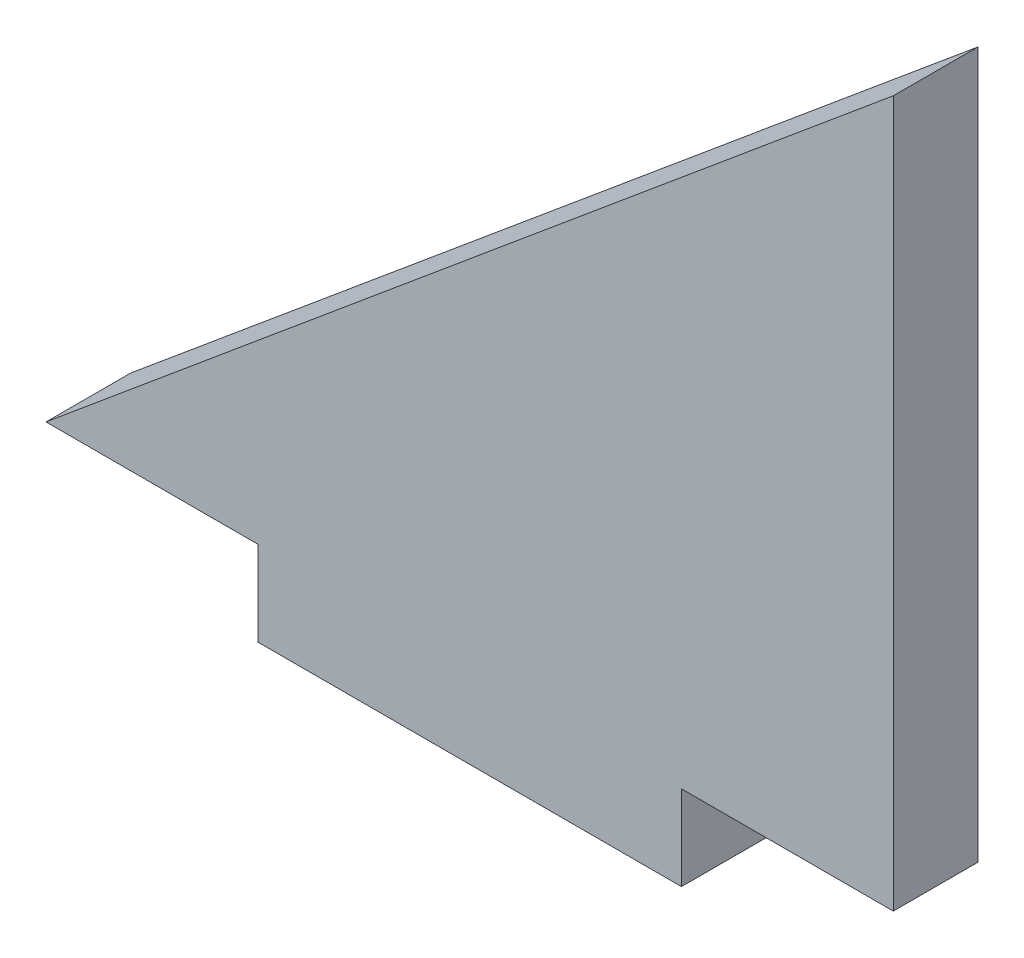
ISO-10303-21;
HEADER;
FILE_DESCRIPTION(('STEP AP214'),'2;1');
FILE_NAME('part.step','',(''),(''),'','','');
FILE_SCHEMA(('AUTOMOTIVE_DESIGN { 1 0 10303 214 1 1 1 1 }'));
ENDSEC;
DATA;
#1=APPLICATION_CONTEXT('core data for automotive mechanical design processes');
#2=APPLICATION_PROTOCOL_DEFINITION('international standard','automotive_design',2000,#1);
#3=PRODUCT_CONTEXT('',#1,'mechanical');
#4=PRODUCT('Part','Part','',(#3));
#5=PRODUCT_RELATED_PRODUCT_CATEGORY('part','',(#4));
#6=PRODUCT_DEFINITION_FORMATION('','',#4);
#7=PRODUCT_DEFINITION_CONTEXT('part definition',#1,'design');
#8=PRODUCT_DEFINITION('design','',#6,#7);
#9=PRODUCT_DEFINITION_SHAPE('','',#8);
#10=(LENGTH_UNIT() NAMED_UNIT(*) SI_UNIT(.MILLI.,.METRE.));
#11=(NAMED_UNIT(*) PLANE_ANGLE_UNIT() SI_UNIT($,.RADIAN.));
#12=(NAMED_UNIT(*) SI_UNIT($,.STERADIAN.) SOLID_ANGLE_UNIT());
#13=UNCERTAINTY_MEASURE_WITH_UNIT(LENGTH_MEASURE(1.E-05),#10,'distance_accuracy_value','');
#14=(GEOMETRIC_REPRESENTATION_CONTEXT(3) GLOBAL_UNCERTAINTY_ASSIGNED_CONTEXT((#13)) GLOBAL_UNIT_ASSIGNED_CONTEXT((#10,
#11,#12)) REPRESENTATION_CONTEXT('',''));
#15=CARTESIAN_POINT('',(0.,0.,0.));
#16=DIRECTION('',(0.,0.,1.));
#17=DIRECTION('',(1.,0.,0.));
#18=AXIS2_PLACEMENT_3D('',#15,#16,#17);
#19=CARTESIAN_POINT('',(0.,25.,1.5));
#20=DIRECTION('',(-1.,0.,0.));
#21=DIRECTION('',(0.,0.,1.));
#22=AXIS2_PLACEMENT_3D('',#19,#20,#21);
#23=PLANE('',#22);
#24=DIRECTION('',(0.,1.,0.));
#25=VECTOR('',#24,1.);
#26=CARTESIAN_POINT('',(0.,25.,-1.5));
#27=LINE('',#26,#25);
#28=CARTESIAN_POINT('',(0.,0.,-1.5));
#29=VERTEX_POINT('',#28);
#30=CARTESIAN_POINT('',(0.,25.,-1.5));
#31=VERTEX_POINT('',#30);
#32=EDGE_CURVE('E129',#29,#31,#27,.T.);
#33=ORIENTED_EDGE('',*,*,#32,.T.);
#34=DIRECTION('',(0.,0.,-1.));
#35=VECTOR('',#34,1.);
#36=CARTESIAN_POINT('',(0.,25.,1.5));
#37=LINE('',#36,#35);
#38=CARTESIAN_POINT('',(0.,25.,1.5));
#39=VERTEX_POINT('',#38);
#40=EDGE_CURVE('E11',#39,#31,#37,.T.);
#41=ORIENTED_EDGE('',*,*,#40,.F.);
#42=DIRECTION('',(0.,1.,0.));
#43=VECTOR('',#42,1.);
#44=CARTESIAN_POINT('',(0.,25.,1.5));
#45=LINE('',#44,#43);
#46=CARTESIAN_POINT('',(0.,0.,1.5));
#47=VERTEX_POINT('',#46);
#48=EDGE_CURVE('E141',#47,#39,#45,.T.);
#49=ORIENTED_EDGE('',*,*,#48,.F.);
#50=DIRECTION('',(0.,0.,-1.));
#51=VECTOR('',#50,1.);
#52=CARTESIAN_POINT('',(0.,0.,1.5));
#53=LINE('',#52,#51);
#54=EDGE_CURVE('E125',#47,#29,#53,.T.);
#55=ORIENTED_EDGE('',*,*,#54,.T.);
#56=EDGE_LOOP('',(#33,#41,#49,#55));
#57=FACE_BOUND('',#56,.T.);
#58=ADVANCED_FACE('F39',(#57),#23,.F.);
#59=CARTESIAN_POINT('',(-30.,0.,1.5));
#60=DIRECTION('',(0.64018439966448,-0.768221279597376,0.));
#61=DIRECTION('',(0.768221279597376,0.64018439966448,0.));
#62=AXIS2_PLACEMENT_3D('',#59,#60,#61);
#63=PLANE('',#62);
#64=DIRECTION('',(-0.768221279597376,-0.64018439966448,0.));
#65=VECTOR('',#64,1.);
#66=CARTESIAN_POINT('',(-30.,0.,-1.5));
#67=LINE('',#66,#65);
#68=CARTESIAN_POINT('',(-30.,0.,-1.5));
#69=VERTEX_POINT('',#68);
#70=EDGE_CURVE('E132',#31,#69,#67,.T.);
#71=ORIENTED_EDGE('',*,*,#70,.T.);
#72=DIRECTION('',(0.,0.,-1.));
#73=VECTOR('',#72,1.);
#74=CARTESIAN_POINT('',(-30.,0.,1.5));
#75=LINE('',#74,#73);
#76=CARTESIAN_POINT('',(-30.,0.,1.5));
#77=VERTEX_POINT('',#76);
#78=EDGE_CURVE('E47',#77,#69,#75,.T.);
#79=ORIENTED_EDGE('',*,*,#78,.F.);
#80=DIRECTION('',(-0.768221279597376,-0.64018439966448,0.));
#81=VECTOR('',#80,1.);
#82=CARTESIAN_POINT('',(-30.,0.,1.5));
#83=LINE('',#82,#81);
#84=EDGE_CURVE('E95',#39,#77,#83,.T.);
#85=ORIENTED_EDGE('',*,*,#84,.F.);
#86=ORIENTED_EDGE('',*,*,#40,.T.);
#87=EDGE_LOOP('',(#71,#79,#85,#86));
#88=FACE_BOUND('',#87,.T.);
#89=ADVANCED_FACE('F166',(#88),#63,.F.);
#90=CARTESIAN_POINT('',(-22.5,0.,1.5));
#91=DIRECTION('',(0.,1.,0.));
#92=DIRECTION('',(-1.,0.,0.));
#93=AXIS2_PLACEMENT_3D('',#90,#91,#92);
#94=PLANE('',#93);
#95=DIRECTION('',(1.,0.,0.));
#96=VECTOR('',#95,1.);
#97=CARTESIAN_POINT('',(-22.5,0.,-1.5));
#98=LINE('',#97,#96);
#99=CARTESIAN_POINT('',(-22.5,0.,-1.5));
#100=VERTEX_POINT('',#99);
#101=EDGE_CURVE('E134',#69,#100,#98,.T.);
#102=ORIENTED_EDGE('',*,*,#101,.T.);
#103=DIRECTION('',(0.,0.,-1.));
#104=VECTOR('',#103,1.);
#105=CARTESIAN_POINT('',(-22.5,0.,1.5));
#106=LINE('',#105,#104);
#107=CARTESIAN_POINT('',(-22.5,0.,1.5));
#108=VERTEX_POINT('',#107);
#109=EDGE_CURVE('E145',#108,#100,#106,.T.);
#110=ORIENTED_EDGE('',*,*,#109,.F.);
#111=DIRECTION('',(1.,0.,0.));
#112=VECTOR('',#111,1.);
#113=CARTESIAN_POINT('',(-22.5,0.,1.5));
#114=LINE('',#113,#112);
#115=EDGE_CURVE('E153',#77,#108,#114,.T.);
#116=ORIENTED_EDGE('',*,*,#115,.F.);
#117=ORIENTED_EDGE('',*,*,#78,.T.);
#118=EDGE_LOOP('',(#102,#110,#116,#117));
#119=FACE_BOUND('',#118,.T.);
#120=ADVANCED_FACE('F151',(#119),#94,.F.);
#121=CARTESIAN_POINT('',(-22.5,0.,1.5));
#122=DIRECTION('',(1.,0.,0.));
#123=DIRECTION('',(0.,0.,-1.));
#124=AXIS2_PLACEMENT_3D('',#121,#122,#123);
#125=PLANE('',#124);
#126=DIRECTION('',(0.,-1.,0.));
#127=VECTOR('',#126,1.);
#128=CARTESIAN_POINT('',(-22.5,0.,-1.5));
#129=LINE('',#128,#127);
#130=CARTESIAN_POINT('',(-22.5,-3.,-1.5));
#131=VERTEX_POINT('',#130);
#132=EDGE_CURVE('E136',#100,#131,#129,.T.);
#133=ORIENTED_EDGE('',*,*,#132,.T.);
#134=DIRECTION('',(0.,0.,-1.));
#135=VECTOR('',#134,1.);
#136=CARTESIAN_POINT('',(-22.5,-3.,1.5));
#137=LINE('',#136,#135);
#138=CARTESIAN_POINT('',(-22.5,-3.,1.5));
#139=VERTEX_POINT('',#138);
#140=EDGE_CURVE('E120',#139,#131,#137,.T.);
#141=ORIENTED_EDGE('',*,*,#140,.F.);
#142=DIRECTION('',(0.,-1.,0.));
#143=VECTOR('',#142,1.);
#144=CARTESIAN_POINT('',(-22.5,0.,1.5));
#145=LINE('',#144,#143);
#146=EDGE_CURVE('E111',#108,#139,#145,.T.);
#147=ORIENTED_EDGE('',*,*,#146,.F.);
#148=ORIENTED_EDGE('',*,*,#109,.T.);
#149=EDGE_LOOP('',(#133,#141,#147,#148));
#150=FACE_BOUND('',#149,.T.);
#151=ADVANCED_FACE('F159',(#150),#125,.F.);
#152=CARTESIAN_POINT('',(-22.5,-3.,1.5));
#153=DIRECTION('',(0.,1.,0.));
#154=DIRECTION('',(-1.,0.,0.));
#155=AXIS2_PLACEMENT_3D('',#152,#153,#154);
#156=PLANE('',#155);
#157=DIRECTION('',(1.,0.,0.));
#158=VECTOR('',#157,1.);
#159=CARTESIAN_POINT('',(-22.5,-3.,-1.5));
#160=LINE('',#159,#158);
#161=CARTESIAN_POINT('',(-7.5,-3.,-1.5));
#162=VERTEX_POINT('',#161);
#163=EDGE_CURVE('E119',#131,#162,#160,.T.);
#164=ORIENTED_EDGE('',*,*,#163,.T.);
#165=DIRECTION('',(0.,0.,-1.));
#166=VECTOR('',#165,1.);
#167=CARTESIAN_POINT('',(-7.5,-3.,1.5));
#168=LINE('',#167,#166);
#169=CARTESIAN_POINT('',(-7.5,-3.,1.5));
#170=VERTEX_POINT('',#169);
#171=EDGE_CURVE('E116',#170,#162,#168,.T.);
#172=ORIENTED_EDGE('',*,*,#171,.F.);
#173=DIRECTION('',(1.,0.,0.));
#174=VECTOR('',#173,1.);
#175=CARTESIAN_POINT('',(-22.5,-3.,1.5));
#176=LINE('',#175,#174);
#177=EDGE_CURVE('E105',#139,#170,#176,.T.);
#178=ORIENTED_EDGE('',*,*,#177,.F.);
#179=ORIENTED_EDGE('',*,*,#140,.T.);
#180=EDGE_LOOP('',(#164,#172,#178,#179));
#181=FACE_BOUND('',#180,.T.);
#182=ADVANCED_FACE('F117',(#181),#156,.F.);
#183=CARTESIAN_POINT('',(-7.5,0.,1.5));
#184=DIRECTION('',(-1.,0.,0.));
#185=DIRECTION('',(0.,0.,1.));
#186=AXIS2_PLACEMENT_3D('',#183,#184,#185);
#187=PLANE('',#186);
#188=DIRECTION('',(0.,1.,0.));
#189=VECTOR('',#188,1.);
#190=CARTESIAN_POINT('',(-7.5,0.,-1.5));
#191=LINE('',#190,#189);
#192=CARTESIAN_POINT('',(-7.5,0.,-1.5));
#193=VERTEX_POINT('',#192);
#194=EDGE_CURVE('E81',#162,#193,#191,.T.);
#195=ORIENTED_EDGE('',*,*,#194,.T.);
#196=DIRECTION('',(0.,0.,-1.));
#197=VECTOR('',#196,1.);
#198=CARTESIAN_POINT('',(-7.5,0.,1.5));
#199=LINE('',#198,#197);
#200=CARTESIAN_POINT('',(-7.5,0.,1.5));
#201=VERTEX_POINT('',#200);
#202=EDGE_CURVE('E121',#201,#193,#199,.T.);
#203=ORIENTED_EDGE('',*,*,#202,.F.);
#204=DIRECTION('',(0.,1.,0.));
#205=VECTOR('',#204,1.);
#206=CARTESIAN_POINT('',(-7.5,0.,1.5));
#207=LINE('',#206,#205);
#208=EDGE_CURVE('E109',#170,#201,#207,.T.);
#209=ORIENTED_EDGE('',*,*,#208,.F.);
#210=ORIENTED_EDGE('',*,*,#171,.T.);
#211=EDGE_LOOP('',(#195,#203,#209,#210));
#212=FACE_BOUND('',#211,.T.);
#213=ADVANCED_FACE('F123',(#212),#187,.F.);
#214=CARTESIAN_POINT('',(0.,0.,1.5));
#215=DIRECTION('',(0.,1.,0.));
#216=DIRECTION('',(-1.,0.,0.));
#217=AXIS2_PLACEMENT_3D('',#214,#215,#216);
#218=PLANE('',#217);
#219=DIRECTION('',(1.,0.,0.));
#220=VECTOR('',#219,1.);
#221=CARTESIAN_POINT('',(0.,0.,-1.5));
#222=LINE('',#221,#220);
#223=EDGE_CURVE('E87',#193,#29,#222,.T.);
#224=ORIENTED_EDGE('',*,*,#223,.T.);
#225=ORIENTED_EDGE('',*,*,#54,.F.);
#226=DIRECTION('',(1.,0.,0.));
#227=VECTOR('',#226,1.);
#228=CARTESIAN_POINT('',(0.,0.,1.5));
#229=LINE('',#228,#227);
#230=EDGE_CURVE('E55',#201,#47,#229,.T.);
#231=ORIENTED_EDGE('',*,*,#230,.F.);
#232=ORIENTED_EDGE('',*,*,#202,.T.);
#233=EDGE_LOOP('',(#224,#225,#231,#232));
#234=FACE_BOUND('',#233,.T.);
#235=ADVANCED_FACE('F180',(#234),#218,.F.);
#236=CARTESIAN_POINT('',(0.,0.,1.5));
#237=DIRECTION('',(0.,0.,-1.));
#238=DIRECTION('',(-1.,0.,0.));
#239=AXIS2_PLACEMENT_3D('',#236,#237,#238);
#240=PLANE('',#239);
#241=ORIENTED_EDGE('',*,*,#48,.T.);
#242=ORIENTED_EDGE('',*,*,#84,.T.);
#243=ORIENTED_EDGE('',*,*,#115,.T.);
#244=ORIENTED_EDGE('',*,*,#146,.T.);
#245=ORIENTED_EDGE('',*,*,#177,.T.);
#246=ORIENTED_EDGE('',*,*,#208,.T.);
#247=ORIENTED_EDGE('',*,*,#230,.T.);
#248=EDGE_LOOP('',(#241,#242,#243,#244,#245,#246,#247));
#249=FACE_BOUND('',#248,.T.);
#250=ADVANCED_FACE('F107',(#249),#240,.F.);
#251=CARTESIAN_POINT('',(0.,0.,-1.5));
#252=DIRECTION('',(0.,0.,-1.));
#253=DIRECTION('',(-1.,0.,0.));
#254=AXIS2_PLACEMENT_3D('',#251,#252,#253);
#255=PLANE('',#254);
#256=ORIENTED_EDGE('',*,*,#32,.F.);
#257=ORIENTED_EDGE('',*,*,#223,.F.);
#258=ORIENTED_EDGE('',*,*,#194,.F.);
#259=ORIENTED_EDGE('',*,*,#163,.F.);
#260=ORIENTED_EDGE('',*,*,#132,.F.);
#261=ORIENTED_EDGE('',*,*,#101,.F.);
#262=ORIENTED_EDGE('',*,*,#70,.F.);
#263=EDGE_LOOP('',(#256,#257,#258,#259,#260,#261,#262));
#264=FACE_BOUND('',#263,.T.);
#265=ADVANCED_FACE('F157',(#264),#255,.T.);
#266=CLOSED_SHELL('',(#58,#89,#120,#151,#182,#213,#235,#250,#265));
#267=MANIFOLD_SOLID_BREP('B2',#266);
#268=ADVANCED_BREP_SHAPE_REPRESENTATION('',(#18,#267),#14);
#269=SHAPE_DEFINITION_REPRESENTATION(#9,#268);
ENDSEC;
END-ISO-10303-21;
